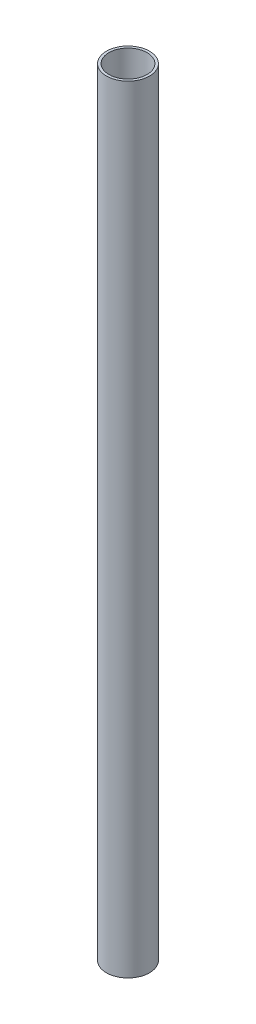
ISO-10303-21;
HEADER;
FILE_DESCRIPTION(('STEP AP214'),'2;1');
FILE_NAME('part.step','',(''),(''),'','','');
FILE_SCHEMA(('AUTOMOTIVE_DESIGN { 1 0 10303 214 1 1 1 1 }'));
ENDSEC;
DATA;
#1=APPLICATION_CONTEXT('core data for automotive mechanical design processes');
#2=APPLICATION_PROTOCOL_DEFINITION('international standard','automotive_design',2000,#1);
#3=PRODUCT_CONTEXT('',#1,'mechanical');
#4=PRODUCT('Part','Part','',(#3));
#5=PRODUCT_RELATED_PRODUCT_CATEGORY('part','',(#4));
#6=PRODUCT_DEFINITION_FORMATION('','',#4);
#7=PRODUCT_DEFINITION_CONTEXT('part definition',#1,'design');
#8=PRODUCT_DEFINITION('design','',#6,#7);
#9=PRODUCT_DEFINITION_SHAPE('','',#8);
#10=(LENGTH_UNIT() NAMED_UNIT(*) SI_UNIT(.MILLI.,.METRE.));
#11=(NAMED_UNIT(*) PLANE_ANGLE_UNIT() SI_UNIT($,.RADIAN.));
#12=(NAMED_UNIT(*) SI_UNIT($,.STERADIAN.) SOLID_ANGLE_UNIT());
#13=UNCERTAINTY_MEASURE_WITH_UNIT(LENGTH_MEASURE(1.E-05),#10,'distance_accuracy_value','');
#14=(GEOMETRIC_REPRESENTATION_CONTEXT(3) GLOBAL_UNCERTAINTY_ASSIGNED_CONTEXT((#13)) GLOBAL_UNIT_ASSIGNED_CONTEXT((#10,
#11,#12)) REPRESENTATION_CONTEXT('',''));
#15=CARTESIAN_POINT('',(0.,0.,0.));
#16=DIRECTION('',(0.,0.,1.));
#17=DIRECTION('',(1.,0.,0.));
#18=AXIS2_PLACEMENT_3D('',#15,#16,#17);
#19=CARTESIAN_POINT('',(163.047462271699,34.1516094451203,0.));
#20=DIRECTION('',(0.,1.,0.));
#21=DIRECTION('',(-1.,0.,0.));
#22=AXIS2_PLACEMENT_3D('',#19,#20,#21);
#23=CYLINDRICAL_SURFACE('',#22,6.35);
#24=CARTESIAN_POINT('',(163.047462271699,52.1121216872586,0.));
#25=DIRECTION('',(0.,1.,0.));
#26=DIRECTION('',(0.837169104331223,0.,0.546944138603988));
#27=AXIS2_PLACEMENT_3D('',#24,#25,#26);
#28=CIRCLE('',#27,6.35);
#29=CARTESIAN_POINT('',(168.363486084203,52.1121216872586,3.47309528013527));
#30=VERTEX_POINT('',#29);
#31=EDGE_CURVE('E39',#30,#30,#28,.T.);
#32=ORIENTED_EDGE('',*,*,#31,.T.);
#33=EDGE_LOOP('',(#32));
#34=FACE_BOUND('',#33,.T.);
#35=CARTESIAN_POINT('',(163.047462271699,280.991966611506,0.));
#36=DIRECTION('',(0.,-1.,0.));
#37=DIRECTION('',(-1.,0.,0.));
#38=AXIS2_PLACEMENT_3D('',#35,#36,#37);
#39=CIRCLE('',#38,6.35);
#40=CARTESIAN_POINT('',(156.697462271699,280.991966611506,0.));
#41=VERTEX_POINT('',#40);
#42=EDGE_CURVE('E43',#41,#41,#39,.T.);
#43=ORIENTED_EDGE('',*,*,#42,.T.);
#44=EDGE_LOOP('',(#43));
#45=FACE_BOUND('',#44,.T.);
#46=ADVANCED_FACE('F33',(#34,#45),#23,.T.);
#47=CARTESIAN_POINT('',(163.047462271699,34.1516094451203,0.));
#48=DIRECTION('',(0.,1.,0.));
#49=DIRECTION('',(-1.,0.,0.));
#50=AXIS2_PLACEMENT_3D('',#47,#48,#49);
#51=CYLINDRICAL_SURFACE('',#50,5.6134);
#52=CARTESIAN_POINT('',(163.047462271699,52.1121216872586,0.));
#53=DIRECTION('',(0.,1.,0.));
#54=DIRECTION('',(-1.,0.,0.));
#55=AXIS2_PLACEMENT_3D('',#52,#53,#54);
#56=CIRCLE('',#55,5.6134);
#57=CARTESIAN_POINT('',(157.434062271699,52.1121216872586,0.));
#58=VERTEX_POINT('',#57);
#59=EDGE_CURVE('E10',#58,#58,#56,.F.);
#60=ORIENTED_EDGE('',*,*,#59,.T.);
#61=EDGE_LOOP('',(#60));
#62=FACE_BOUND('',#61,.T.);
#63=CARTESIAN_POINT('',(163.047462271699,280.991966611506,0.));
#64=DIRECTION('',(0.,-1.,0.));
#65=DIRECTION('',(1.,0.,0.));
#66=AXIS2_PLACEMENT_3D('',#63,#64,#65);
#67=CIRCLE('',#66,5.6134);
#68=CARTESIAN_POINT('',(168.660862271699,280.991966611506,0.));
#69=VERTEX_POINT('',#68);
#70=EDGE_CURVE('E47',#69,#69,#67,.T.);
#71=ORIENTED_EDGE('',*,*,#70,.F.);
#72=EDGE_LOOP('',(#71));
#73=FACE_BOUND('',#72,.T.);
#74=ADVANCED_FACE('F56',(#62,#73),#51,.F.);
#75=CARTESIAN_POINT('',(163.047462271699,52.1121216872586,0.));
#76=DIRECTION('',(0.,1.,0.));
#77=DIRECTION('',(0.837169104331223,0.,0.546944138603988));
#78=AXIS2_PLACEMENT_3D('',#75,#76,#77);
#79=PLANE('',#78);
#80=ORIENTED_EDGE('',*,*,#31,.F.);
#81=EDGE_LOOP('',(#80));
#82=FACE_BOUND('',#81,.T.);
#83=ORIENTED_EDGE('',*,*,#59,.F.);
#84=EDGE_LOOP('',(#83));
#85=FACE_BOUND('',#84,.T.);
#86=ADVANCED_FACE('F58',(#82,#85),#79,.F.);
#87=CARTESIAN_POINT('',(163.047462271699,280.991966611506,0.));
#88=DIRECTION('',(0.,-1.,0.));
#89=DIRECTION('',(-1.,0.,0.));
#90=AXIS2_PLACEMENT_3D('',#87,#88,#89);
#91=PLANE('',#90);
#92=ORIENTED_EDGE('',*,*,#70,.T.);
#93=EDGE_LOOP('',(#92));
#94=FACE_BOUND('',#93,.T.);
#95=ORIENTED_EDGE('',*,*,#42,.F.);
#96=EDGE_LOOP('',(#95));
#97=FACE_BOUND('',#96,.T.);
#98=ADVANCED_FACE('F53',(#94,#97),#91,.F.);
#99=CLOSED_SHELL('',(#46,#74,#86,#98));
#100=MANIFOLD_SOLID_BREP('B2',#99);
#101=ADVANCED_BREP_SHAPE_REPRESENTATION('',(#18,#100),#14);
#102=SHAPE_DEFINITION_REPRESENTATION(#9,#101);
ENDSEC;
END-ISO-10303-21;
